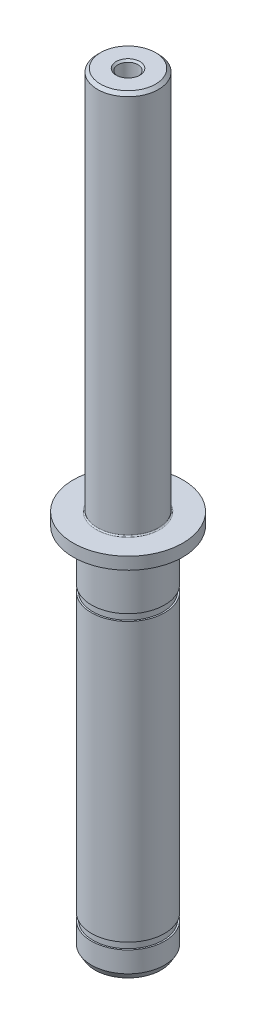
ISO-10303-21;
HEADER;
FILE_DESCRIPTION(('STEP AP214'),'2;1');
FILE_NAME('part.step','',(''),(''),'','','');
FILE_SCHEMA(('AUTOMOTIVE_DESIGN { 1 0 10303 214 1 1 1 1 }'));
ENDSEC;
DATA;
#1=APPLICATION_CONTEXT('core data for automotive mechanical design processes');
#2=APPLICATION_PROTOCOL_DEFINITION('international standard','automotive_design',2000,#1);
#3=PRODUCT_CONTEXT('',#1,'mechanical');
#4=PRODUCT('Part','Part','',(#3));
#5=PRODUCT_RELATED_PRODUCT_CATEGORY('part','',(#4));
#6=PRODUCT_DEFINITION_FORMATION('','',#4);
#7=PRODUCT_DEFINITION_CONTEXT('part definition',#1,'design');
#8=PRODUCT_DEFINITION('design','',#6,#7);
#9=PRODUCT_DEFINITION_SHAPE('','',#8);
#10=(LENGTH_UNIT() NAMED_UNIT(*) SI_UNIT(.MILLI.,.METRE.));
#11=(NAMED_UNIT(*) PLANE_ANGLE_UNIT() SI_UNIT($,.RADIAN.));
#12=(NAMED_UNIT(*) SI_UNIT($,.STERADIAN.) SOLID_ANGLE_UNIT());
#13=UNCERTAINTY_MEASURE_WITH_UNIT(LENGTH_MEASURE(1.E-05),#10,'distance_accuracy_value','');
#14=(GEOMETRIC_REPRESENTATION_CONTEXT(3) GLOBAL_UNCERTAINTY_ASSIGNED_CONTEXT((#13)) GLOBAL_UNIT_ASSIGNED_CONTEXT((#10,
#11,#12)) REPRESENTATION_CONTEXT('',''));
#15=CARTESIAN_POINT('',(0.,0.,0.));
#16=DIRECTION('',(0.,0.,1.));
#17=DIRECTION('',(1.,0.,0.));
#18=AXIS2_PLACEMENT_3D('',#15,#16,#17);
#19=CARTESIAN_POINT('',(0.,0.,0.));
#20=DIRECTION('',(0.,-1.,0.));
#21=DIRECTION('',(0.,0.,-1.));
#22=AXIS2_PLACEMENT_3D('',#19,#20,#21);
#23=CYLINDRICAL_SURFACE('',#22,6.);
#24=CARTESIAN_POINT('',(0.,5.5,0.));
#25=DIRECTION('',(0.,-1.,0.));
#26=DIRECTION('',(0.,0.,-1.));
#27=AXIS2_PLACEMENT_3D('',#24,#25,#26);
#28=CIRCLE('',#27,6.);
#29=CARTESIAN_POINT('',(0.,5.5,-6.));
#30=VERTEX_POINT('',#29);
#31=EDGE_CURVE('E99',#30,#30,#28,.T.);
#32=ORIENTED_EDGE('',*,*,#31,.F.);
#33=EDGE_LOOP('',(#32));
#34=FACE_BOUND('',#33,.T.);
#35=CARTESIAN_POINT('',(0.,51.1,0.));
#36=DIRECTION('',(0.,-1.,0.));
#37=DIRECTION('',(0.,0.,-1.));
#38=AXIS2_PLACEMENT_3D('',#35,#36,#37);
#39=CIRCLE('',#38,6.);
#40=CARTESIAN_POINT('',(0.,51.1,-6.));
#41=VERTEX_POINT('',#40);
#42=EDGE_CURVE('E67',#41,#41,#39,.T.);
#43=ORIENTED_EDGE('',*,*,#42,.T.);
#44=EDGE_LOOP('',(#43));
#45=FACE_BOUND('',#44,.T.);
#46=ADVANCED_FACE('F46',(#34,#45),#23,.T.);
#47=CARTESIAN_POINT('',(-6.,5.5,0.));
#48=DIRECTION('',(0.,1.,0.));
#49=DIRECTION('',(0.,0.,1.));
#50=AXIS2_PLACEMENT_3D('',#47,#48,#49);
#51=PLANE('',#50);
#52=CARTESIAN_POINT('',(0.,5.5,0.));
#53=DIRECTION('',(0.,-1.,0.));
#54=DIRECTION('',(0.,0.,-1.));
#55=AXIS2_PLACEMENT_3D('',#52,#53,#54);
#56=CIRCLE('',#55,5.75);
#57=CARTESIAN_POINT('',(0.,5.5,-5.75));
#58=VERTEX_POINT('',#57);
#59=EDGE_CURVE('E96',#58,#58,#56,.T.);
#60=ORIENTED_EDGE('',*,*,#59,.F.);
#61=EDGE_LOOP('',(#60));
#62=FACE_BOUND('',#61,.T.);
#63=ORIENTED_EDGE('',*,*,#31,.T.);
#64=EDGE_LOOP('',(#63));
#65=FACE_BOUND('',#64,.T.);
#66=ADVANCED_FACE('F131',(#62,#65),#51,.F.);
#67=CARTESIAN_POINT('',(0.,0.,0.));
#68=DIRECTION('',(0.,-1.,0.));
#69=DIRECTION('',(0.,0.,-1.));
#70=AXIS2_PLACEMENT_3D('',#67,#68,#69);
#71=CYLINDRICAL_SURFACE('',#70,5.75);
#72=CARTESIAN_POINT('',(0.,4.4,0.));
#73=DIRECTION('',(0.,-1.,0.));
#74=DIRECTION('',(0.,0.,-1.));
#75=AXIS2_PLACEMENT_3D('',#72,#73,#74);
#76=CIRCLE('',#75,5.75);
#77=CARTESIAN_POINT('',(0.,4.4,-5.75));
#78=VERTEX_POINT('',#77);
#79=EDGE_CURVE('E93',#78,#78,#76,.T.);
#80=ORIENTED_EDGE('',*,*,#79,.F.);
#81=EDGE_LOOP('',(#80));
#82=FACE_BOUND('',#81,.T.);
#83=ORIENTED_EDGE('',*,*,#59,.T.);
#84=EDGE_LOOP('',(#83));
#85=FACE_BOUND('',#84,.T.);
#86=ADVANCED_FACE('F137',(#82,#85),#71,.T.);
#87=CARTESIAN_POINT('',(-5.75,4.4,0.));
#88=DIRECTION('',(0.,-1.,0.));
#89=DIRECTION('',(0.,0.,-1.));
#90=AXIS2_PLACEMENT_3D('',#87,#88,#89);
#91=PLANE('',#90);
#92=CARTESIAN_POINT('',(0.,4.4,0.));
#93=DIRECTION('',(0.,-1.,0.));
#94=DIRECTION('',(0.,0.,-1.));
#95=AXIS2_PLACEMENT_3D('',#92,#93,#94);
#96=CIRCLE('',#95,6.);
#97=CARTESIAN_POINT('',(0.,4.4,-6.));
#98=VERTEX_POINT('',#97);
#99=EDGE_CURVE('E90',#98,#98,#96,.T.);
#100=ORIENTED_EDGE('',*,*,#99,.F.);
#101=EDGE_LOOP('',(#100));
#102=FACE_BOUND('',#101,.T.);
#103=ORIENTED_EDGE('',*,*,#79,.T.);
#104=EDGE_LOOP('',(#103));
#105=FACE_BOUND('',#104,.T.);
#106=ADVANCED_FACE('F201',(#102,#105),#91,.F.);
#107=CARTESIAN_POINT('',(0.,0.,0.));
#108=DIRECTION('',(0.,-1.,0.));
#109=DIRECTION('',(0.,0.,-1.));
#110=AXIS2_PLACEMENT_3D('',#107,#108,#109);
#111=CYLINDRICAL_SURFACE('',#110,6.);
#112=CARTESIAN_POINT('',(0.,0.999999999999966,0.));
#113=DIRECTION('',(0.,1.,0.));
#114=DIRECTION('',(0.,0.,1.));
#115=AXIS2_PLACEMENT_3D('',#112,#113,#114);
#116=CIRCLE('',#115,6.);
#117=CARTESIAN_POINT('',(0.,0.999999999999966,6.));
#118=VERTEX_POINT('',#117);
#119=EDGE_CURVE('E111',#118,#118,#116,.T.);
#120=ORIENTED_EDGE('',*,*,#119,.T.);
#121=EDGE_LOOP('',(#120));
#122=FACE_BOUND('',#121,.T.);
#123=ORIENTED_EDGE('',*,*,#99,.T.);
#124=EDGE_LOOP('',(#123));
#125=FACE_BOUND('',#124,.T.);
#126=ADVANCED_FACE('F197',(#122,#125),#111,.T.);
#127=CARTESIAN_POINT('',(-6.,0.,0.));
#128=DIRECTION('',(0.,1.,0.));
#129=DIRECTION('',(0.,0.,1.));
#130=AXIS2_PLACEMENT_3D('',#127,#128,#129);
#131=PLANE('',#130);
#132=CARTESIAN_POINT('',(0.,0.,0.));
#133=DIRECTION('',(0.,1.,0.));
#134=DIRECTION('',(0.,0.,1.));
#135=AXIS2_PLACEMENT_3D('',#132,#133,#134);
#136=CIRCLE('',#135,5.4226497308104);
#137=CARTESIAN_POINT('',(0.,0.,5.4226497308104));
#138=VERTEX_POINT('',#137);
#139=EDGE_CURVE('E108',#138,#138,#136,.F.);
#140=ORIENTED_EDGE('',*,*,#139,.T.);
#141=EDGE_LOOP('',(#140));
#142=FACE_BOUND('',#141,.T.);
#143=ADVANCED_FACE('F193',(#142),#131,.F.);
#144=CARTESIAN_POINT('',(-5.,125.5,0.));
#145=DIRECTION('',(0.,-1.,0.));
#146=DIRECTION('',(0.,0.,-1.));
#147=AXIS2_PLACEMENT_3D('',#144,#145,#146);
#148=PLANE('',#147);
#149=CARTESIAN_POINT('',(0.,125.5,0.));
#150=DIRECTION('',(0.,-1.,0.));
#151=DIRECTION('',(0.,0.,-1.));
#152=AXIS2_PLACEMENT_3D('',#149,#150,#151);
#153=CIRCLE('',#152,1.95000000000002);
#154=CARTESIAN_POINT('',(0.,125.5,-1.95000000000002));
#155=VERTEX_POINT('',#154);
#156=EDGE_CURVE('E11',#155,#155,#153,.T.);
#157=ORIENTED_EDGE('',*,*,#156,.T.);
#158=EDGE_LOOP('',(#157));
#159=FACE_BOUND('',#158,.T.);
#160=CARTESIAN_POINT('',(0.,125.5,0.));
#161=DIRECTION('',(0.,-1.,0.));
#162=DIRECTION('',(0.,0.,-1.));
#163=AXIS2_PLACEMENT_3D('',#160,#161,#162);
#164=CIRCLE('',#163,4.49999999999996);
#165=CARTESIAN_POINT('',(0.,125.5,-4.49999999999996));
#166=VERTEX_POINT('',#165);
#167=EDGE_CURVE('E105',#166,#166,#164,.F.);
#168=ORIENTED_EDGE('',*,*,#167,.T.);
#169=EDGE_LOOP('',(#168));
#170=FACE_BOUND('',#169,.T.);
#171=ADVANCED_FACE('F189',(#159,#170),#148,.F.);
#172=CARTESIAN_POINT('',(0.,0.,0.));
#173=DIRECTION('',(0.,-1.,0.));
#174=DIRECTION('',(0.,0.,-1.));
#175=AXIS2_PLACEMENT_3D('',#172,#173,#174);
#176=CYLINDRICAL_SURFACE('',#175,5.);
#177=CARTESIAN_POINT('',(0.,62.7,0.));
#178=DIRECTION('',(0.,-1.,0.));
#179=DIRECTION('',(0.,0.,-1.));
#180=AXIS2_PLACEMENT_3D('',#177,#178,#179);
#181=CIRCLE('',#180,5.);
#182=CARTESIAN_POINT('',(0.,62.7,-5.));
#183=VERTEX_POINT('',#182);
#184=EDGE_CURVE('E117',#183,#183,#181,.F.);
#185=ORIENTED_EDGE('',*,*,#184,.T.);
#186=EDGE_LOOP('',(#185));
#187=FACE_BOUND('',#186,.T.);
#188=CARTESIAN_POINT('',(0.,125.,0.));
#189=DIRECTION('',(0.,-1.,0.));
#190=DIRECTION('',(0.,0.,-1.));
#191=AXIS2_PLACEMENT_3D('',#188,#189,#190);
#192=CIRCLE('',#191,5.);
#193=CARTESIAN_POINT('',(0.,125.,-5.));
#194=VERTEX_POINT('',#193);
#195=EDGE_CURVE('E102',#194,#194,#192,.T.);
#196=ORIENTED_EDGE('',*,*,#195,.T.);
#197=EDGE_LOOP('',(#196));
#198=FACE_BOUND('',#197,.T.);
#199=ADVANCED_FACE('F170',(#187,#198),#176,.T.);
#200=CARTESIAN_POINT('',(-9.,62.5,0.));
#201=DIRECTION('',(0.,-1.,0.));
#202=DIRECTION('',(0.,0.,-1.));
#203=AXIS2_PLACEMENT_3D('',#200,#201,#202);
#204=PLANE('',#203);
#205=CARTESIAN_POINT('',(0.,62.5,0.));
#206=DIRECTION('',(0.,-1.,0.));
#207=DIRECTION('',(0.,0.,-1.));
#208=AXIS2_PLACEMENT_3D('',#205,#206,#207);
#209=CIRCLE('',#208,5.2);
#210=CARTESIAN_POINT('',(0.,62.5,-5.2));
#211=VERTEX_POINT('',#210);
#212=EDGE_CURVE('E114',#211,#211,#209,.T.);
#213=ORIENTED_EDGE('',*,*,#212,.T.);
#214=EDGE_LOOP('',(#213));
#215=FACE_BOUND('',#214,.T.);
#216=CARTESIAN_POINT('',(0.,62.5,0.));
#217=DIRECTION('',(0.,-1.,0.));
#218=DIRECTION('',(0.,0.,-1.));
#219=AXIS2_PLACEMENT_3D('',#216,#217,#218);
#220=CIRCLE('',#219,9.);
#221=CARTESIAN_POINT('',(0.,62.5,-9.));
#222=VERTEX_POINT('',#221);
#223=EDGE_CURVE('E87',#222,#222,#220,.T.);
#224=ORIENTED_EDGE('',*,*,#223,.F.);
#225=EDGE_LOOP('',(#224));
#226=FACE_BOUND('',#225,.T.);
#227=ADVANCED_FACE('F166',(#215,#226),#204,.F.);
#228=CARTESIAN_POINT('',(0.,0.,0.));
#229=DIRECTION('',(0.,-1.,0.));
#230=DIRECTION('',(0.,0.,-1.));
#231=AXIS2_PLACEMENT_3D('',#228,#229,#230);
#232=CYLINDRICAL_SURFACE('',#231,9.);
#233=CARTESIAN_POINT('',(0.,60.5,0.));
#234=DIRECTION('',(0.,-1.,0.));
#235=DIRECTION('',(0.,0.,-1.));
#236=AXIS2_PLACEMENT_3D('',#233,#234,#235);
#237=CIRCLE('',#236,9.);
#238=CARTESIAN_POINT('',(0.,60.5,-9.));
#239=VERTEX_POINT('',#238);
#240=EDGE_CURVE('E84',#239,#239,#237,.T.);
#241=ORIENTED_EDGE('',*,*,#240,.F.);
#242=EDGE_LOOP('',(#241));
#243=FACE_BOUND('',#242,.T.);
#244=ORIENTED_EDGE('',*,*,#223,.T.);
#245=EDGE_LOOP('',(#244));
#246=FACE_BOUND('',#245,.T.);
#247=ADVANCED_FACE('F169',(#243,#246),#232,.T.);
#248=CARTESIAN_POINT('',(-6.,60.5,0.));
#249=DIRECTION('',(0.,1.,0.));
#250=DIRECTION('',(0.,0.,1.));
#251=AXIS2_PLACEMENT_3D('',#248,#249,#250);
#252=PLANE('',#251);
#253=CARTESIAN_POINT('',(0.,60.5,0.));
#254=DIRECTION('',(0.,-1.,0.));
#255=DIRECTION('',(0.,0.,-1.));
#256=AXIS2_PLACEMENT_3D('',#253,#254,#255);
#257=CIRCLE('',#256,6.);
#258=CARTESIAN_POINT('',(0.,60.5,-6.));
#259=VERTEX_POINT('',#258);
#260=EDGE_CURVE('E81',#259,#259,#257,.T.);
#261=ORIENTED_EDGE('',*,*,#260,.F.);
#262=EDGE_LOOP('',(#261));
#263=FACE_BOUND('',#262,.T.);
#264=ORIENTED_EDGE('',*,*,#240,.T.);
#265=EDGE_LOOP('',(#264));
#266=FACE_BOUND('',#265,.T.);
#267=ADVANCED_FACE('F175',(#263,#266),#252,.F.);
#268=CARTESIAN_POINT('',(0.,0.,0.));
#269=DIRECTION('',(0.,-1.,0.));
#270=DIRECTION('',(0.,0.,-1.));
#271=AXIS2_PLACEMENT_3D('',#268,#269,#270);
#272=CYLINDRICAL_SURFACE('',#271,6.);
#273=CARTESIAN_POINT('',(0.,52.2,0.));
#274=DIRECTION('',(0.,-1.,0.));
#275=DIRECTION('',(0.,0.,-1.));
#276=AXIS2_PLACEMENT_3D('',#273,#274,#275);
#277=CIRCLE('',#276,6.);
#278=CARTESIAN_POINT('',(0.,52.2,-6.));
#279=VERTEX_POINT('',#278);
#280=EDGE_CURVE('E78',#279,#279,#277,.T.);
#281=ORIENTED_EDGE('',*,*,#280,.F.);
#282=EDGE_LOOP('',(#281));
#283=FACE_BOUND('',#282,.T.);
#284=ORIENTED_EDGE('',*,*,#260,.T.);
#285=EDGE_LOOP('',(#284));
#286=FACE_BOUND('',#285,.T.);
#287=ADVANCED_FACE('F181',(#283,#286),#272,.T.);
#288=CARTESIAN_POINT('',(-6.,52.2,0.));
#289=DIRECTION('',(0.,1.,0.));
#290=DIRECTION('',(0.,0.,1.));
#291=AXIS2_PLACEMENT_3D('',#288,#289,#290);
#292=PLANE('',#291);
#293=CARTESIAN_POINT('',(0.,52.2,0.));
#294=DIRECTION('',(0.,-1.,0.));
#295=DIRECTION('',(0.,0.,-1.));
#296=AXIS2_PLACEMENT_3D('',#293,#294,#295);
#297=CIRCLE('',#296,5.74999999999999);
#298=CARTESIAN_POINT('',(0.,52.2,-5.74999999999999));
#299=VERTEX_POINT('',#298);
#300=EDGE_CURVE('E75',#299,#299,#297,.T.);
#301=ORIENTED_EDGE('',*,*,#300,.F.);
#302=EDGE_LOOP('',(#301));
#303=FACE_BOUND('',#302,.T.);
#304=ORIENTED_EDGE('',*,*,#280,.T.);
#305=EDGE_LOOP('',(#304));
#306=FACE_BOUND('',#305,.T.);
#307=ADVANCED_FACE('F313',(#303,#306),#292,.F.);
#308=CARTESIAN_POINT('',(0.,0.,0.));
#309=DIRECTION('',(0.,-1.,0.));
#310=DIRECTION('',(0.,0.,-1.));
#311=AXIS2_PLACEMENT_3D('',#308,#309,#310);
#312=CYLINDRICAL_SURFACE('',#311,5.74999999999999);
#313=CARTESIAN_POINT('',(0.,51.1,0.));
#314=DIRECTION('',(0.,-1.,0.));
#315=DIRECTION('',(0.,0.,-1.));
#316=AXIS2_PLACEMENT_3D('',#313,#314,#315);
#317=CIRCLE('',#316,5.74999999999999);
#318=CARTESIAN_POINT('',(0.,51.1,-5.74999999999999));
#319=VERTEX_POINT('',#318);
#320=EDGE_CURVE('E70',#319,#319,#317,.T.);
#321=ORIENTED_EDGE('',*,*,#320,.F.);
#322=EDGE_LOOP('',(#321));
#323=FACE_BOUND('',#322,.T.);
#324=ORIENTED_EDGE('',*,*,#300,.T.);
#325=EDGE_LOOP('',(#324));
#326=FACE_BOUND('',#325,.T.);
#327=ADVANCED_FACE('F303',(#323,#326),#312,.T.);
#328=CARTESIAN_POINT('',(-5.74999999999999,51.1,0.));
#329=DIRECTION('',(0.,-1.,0.));
#330=DIRECTION('',(0.,0.,-1.));
#331=AXIS2_PLACEMENT_3D('',#328,#329,#330);
#332=PLANE('',#331);
#333=ORIENTED_EDGE('',*,*,#42,.F.);
#334=EDGE_LOOP('',(#333));
#335=FACE_BOUND('',#334,.T.);
#336=ORIENTED_EDGE('',*,*,#320,.T.);
#337=EDGE_LOOP('',(#336));
#338=FACE_BOUND('',#337,.T.);
#339=ADVANCED_FACE('F152',(#335,#338),#332,.F.);
#340=CARTESIAN_POINT('',(0.,125.,0.));
#341=DIRECTION('',(0.,-1.,0.));
#342=DIRECTION('',(0.,0.,-1.));
#343=AXIS2_PLACEMENT_3D('',#340,#341,#342);
#344=CONICAL_SURFACE('',#343,5.,0.785398163397472);
#345=ORIENTED_EDGE('',*,*,#167,.F.);
#346=EDGE_LOOP('',(#345));
#347=FACE_BOUND('',#346,.T.);
#348=ORIENTED_EDGE('',*,*,#195,.F.);
#349=EDGE_LOOP('',(#348));
#350=FACE_BOUND('',#349,.T.);
#351=ADVANCED_FACE('F145',(#347,#350),#344,.T.);
#352=CARTESIAN_POINT('',(0.,0.,0.));
#353=DIRECTION('',(0.,1.,0.));
#354=DIRECTION('',(0.,0.,1.));
#355=AXIS2_PLACEMENT_3D('',#352,#353,#354);
#356=CONICAL_SURFACE('',#355,5.4226497308104,0.523598775598294);
#357=ORIENTED_EDGE('',*,*,#119,.F.);
#358=EDGE_LOOP('',(#357));
#359=FACE_BOUND('',#358,.T.);
#360=ORIENTED_EDGE('',*,*,#139,.F.);
#361=EDGE_LOOP('',(#360));
#362=FACE_BOUND('',#361,.T.);
#363=ADVANCED_FACE('F151',(#359,#362),#356,.T.);
#364=CARTESIAN_POINT('',(0.,62.7,0.));
#365=DIRECTION('',(0.,-1.,0.));
#366=DIRECTION('',(0.,0.,-1.));
#367=AXIS2_PLACEMENT_3D('',#364,#365,#366);
#368=TOROIDAL_SURFACE('',#367,5.2,0.2);
#369=ORIENTED_EDGE('',*,*,#184,.F.);
#370=EDGE_LOOP('',(#369));
#371=FACE_BOUND('',#370,.T.);
#372=ORIENTED_EDGE('',*,*,#212,.F.);
#373=EDGE_LOOP('',(#372));
#374=FACE_BOUND('',#373,.T.);
#375=ADVANCED_FACE('F61',(#371,#374),#368,.F.);
#376=CARTESIAN_POINT('',(0.,113.5,0.));
#377=DIRECTION('',(0.,1.,0.));
#378=DIRECTION('',(0.,0.,1.));
#379=AXIS2_PLACEMENT_3D('',#376,#377,#378);
#380=CONICAL_SURFACE('',#379,1.65,1.02974425867665);
#381=CARTESIAN_POINT('',(0.,112.508579978605,0.));
#382=VERTEX_POINT('',#381);
#383=VERTEX_LOOP('',#382);
#384=FACE_BOUND('',#383,.T.);
#385=CARTESIAN_POINT('',(0.,113.5,0.));
#386=DIRECTION('',(0.,1.,0.));
#387=DIRECTION('',(0.,0.,1.));
#388=AXIS2_PLACEMENT_3D('',#385,#386,#387);
#389=CIRCLE('',#388,1.65);
#390=CARTESIAN_POINT('',(0.,113.5,1.65));
#391=VERTEX_POINT('',#390);
#392=EDGE_CURVE('E65',#391,#391,#389,.T.);
#393=ORIENTED_EDGE('',*,*,#392,.T.);
#394=EDGE_LOOP('',(#393));
#395=FACE_BOUND('',#394,.T.);
#396=ADVANCED_FACE('F57',(#384,#395),#380,.F.);
#397=CARTESIAN_POINT('',(0.,125.5,0.));
#398=DIRECTION('',(0.,1.,0.));
#399=DIRECTION('',(0.,0.,1.));
#400=AXIS2_PLACEMENT_3D('',#397,#398,#399);
#401=CYLINDRICAL_SURFACE('',#400,1.64999999999999);
#402=CARTESIAN_POINT('',(0.,125.2,0.));
#403=DIRECTION('',(0.,-1.,0.));
#404=DIRECTION('',(0.,0.,-1.));
#405=AXIS2_PLACEMENT_3D('',#402,#403,#404);
#406=CIRCLE('',#405,1.64999999999999);
#407=CARTESIAN_POINT('',(0.,125.2,-1.64999999999999));
#408=VERTEX_POINT('',#407);
#409=EDGE_CURVE('E54',#408,#408,#406,.F.);
#410=ORIENTED_EDGE('',*,*,#409,.T.);
#411=EDGE_LOOP('',(#410));
#412=FACE_BOUND('',#411,.T.);
#413=ORIENTED_EDGE('',*,*,#392,.F.);
#414=EDGE_LOOP('',(#413));
#415=FACE_BOUND('',#414,.T.);
#416=ADVANCED_FACE('F60',(#412,#415),#401,.F.);
#417=CARTESIAN_POINT('',(0.,125.2,0.));
#418=DIRECTION('',(0.,1.,0.));
#419=DIRECTION('',(0.,0.,1.));
#420=AXIS2_PLACEMENT_3D('',#417,#418,#419);
#421=CONICAL_SURFACE('',#420,1.64999999999999,0.785398163397457);
#422=ORIENTED_EDGE('',*,*,#156,.F.);
#423=EDGE_LOOP('',(#422));
#424=FACE_BOUND('',#423,.T.);
#425=ORIENTED_EDGE('',*,*,#409,.F.);
#426=EDGE_LOOP('',(#425));
#427=FACE_BOUND('',#426,.T.);
#428=ADVANCED_FACE('F49',(#424,#427),#421,.F.);
#429=CLOSED_SHELL('',(#46,#66,#86,#106,#126,#143,#171,#199,#227,#247,#267,#287,#307,#327,#339,
#351,#363,#375,#396,#416,#428));
#430=MANIFOLD_SOLID_BREP('B2',#429);
#431=ADVANCED_BREP_SHAPE_REPRESENTATION('',(#18,#430),#14);
#432=SHAPE_DEFINITION_REPRESENTATION(#9,#431);
ENDSEC;
END-ISO-10303-21;
